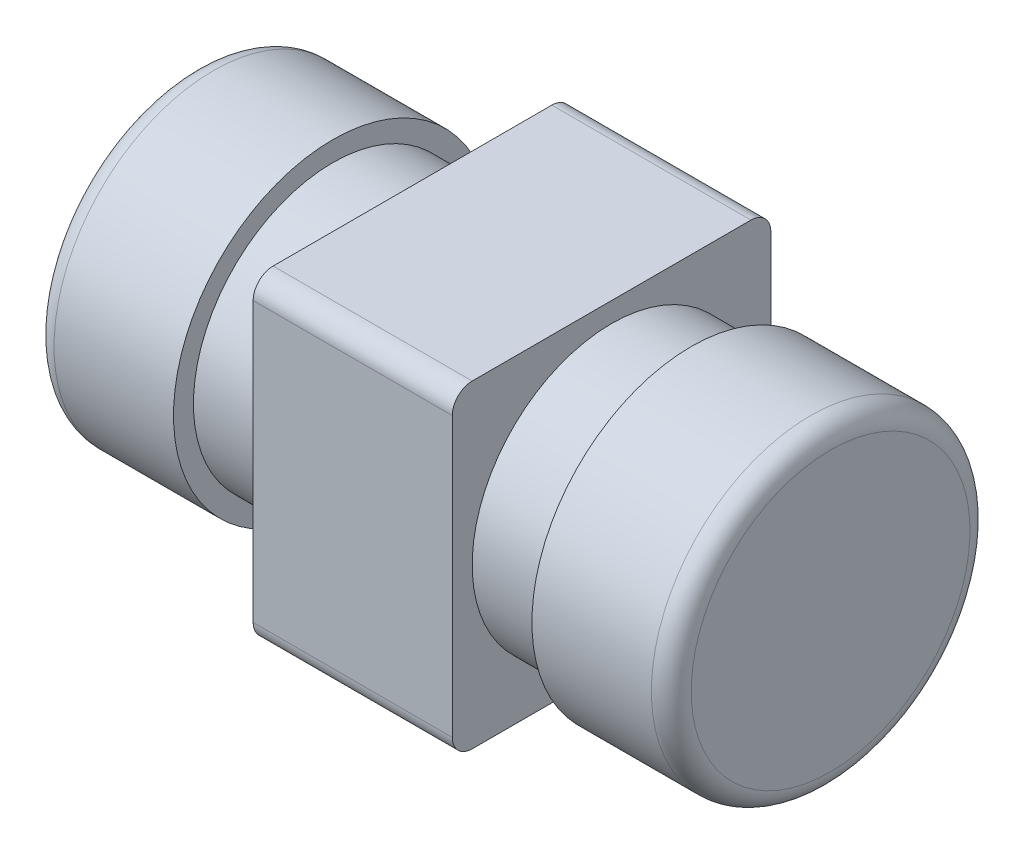
ISO-10303-21;
HEADER;
FILE_DESCRIPTION(('STEP AP214'),'2;1');
FILE_NAME('part.step','',(''),(''),'','','');
FILE_SCHEMA(('AUTOMOTIVE_DESIGN { 1 0 10303 214 1 1 1 1 }'));
ENDSEC;
DATA;
#1=APPLICATION_CONTEXT('core data for automotive mechanical design processes');
#2=APPLICATION_PROTOCOL_DEFINITION('international standard','automotive_design',2000,#1);
#3=PRODUCT_CONTEXT('',#1,'mechanical');
#4=PRODUCT('Part','Part','',(#3));
#5=PRODUCT_RELATED_PRODUCT_CATEGORY('part','',(#4));
#6=PRODUCT_DEFINITION_FORMATION('','',#4);
#7=PRODUCT_DEFINITION_CONTEXT('part definition',#1,'design');
#8=PRODUCT_DEFINITION('design','',#6,#7);
#9=PRODUCT_DEFINITION_SHAPE('','',#8);
#10=(LENGTH_UNIT() NAMED_UNIT(*) SI_UNIT(.MILLI.,.METRE.));
#11=(NAMED_UNIT(*) PLANE_ANGLE_UNIT() SI_UNIT($,.RADIAN.));
#12=(NAMED_UNIT(*) SI_UNIT($,.STERADIAN.) SOLID_ANGLE_UNIT());
#13=UNCERTAINTY_MEASURE_WITH_UNIT(LENGTH_MEASURE(1.E-05),#10,'distance_accuracy_value','');
#14=(GEOMETRIC_REPRESENTATION_CONTEXT(3) GLOBAL_UNCERTAINTY_ASSIGNED_CONTEXT((#13)) GLOBAL_UNIT_ASSIGNED_CONTEXT((#10,
#11,#12)) REPRESENTATION_CONTEXT('',''));
#15=CARTESIAN_POINT('',(0.,0.,0.));
#16=DIRECTION('',(0.,0.,1.));
#17=DIRECTION('',(1.,0.,0.));
#18=AXIS2_PLACEMENT_3D('',#15,#16,#17);
#19=CARTESIAN_POINT('',(-0.5,-0.7,1.5));
#20=DIRECTION('',(1.,0.,0.));
#21=DIRECTION('',(0.,1.,0.));
#22=AXIS2_PLACEMENT_3D('',#19,#20,#21);
#23=CYLINDRICAL_SURFACE('',#22,0.1);
#24=CARTESIAN_POINT('',(-0.5,-0.7,1.5));
#25=DIRECTION('',(-1.,0.,0.));
#26=DIRECTION('',(0.,-1.,0.));
#27=AXIS2_PLACEMENT_3D('',#24,#25,#26);
#28=CIRCLE('',#27,0.1);
#29=CARTESIAN_POINT('',(-0.5,-0.8,1.5));
#30=VERTEX_POINT('',#29);
#31=CARTESIAN_POINT('',(-0.5,-0.7,1.6));
#32=VERTEX_POINT('',#31);
#33=EDGE_CURVE('E241',#30,#32,#28,.T.);
#34=ORIENTED_EDGE('',*,*,#33,.F.);
#35=DIRECTION('',(-1.,0.,0.));
#36=VECTOR('',#35,1.);
#37=CARTESIAN_POINT('',(-0.5,-0.8,1.5));
#38=LINE('',#37,#36);
#39=CARTESIAN_POINT('',(0.5,-0.8,1.5));
#40=VERTEX_POINT('',#39);
#41=EDGE_CURVE('E199',#40,#30,#38,.T.);
#42=ORIENTED_EDGE('',*,*,#41,.F.);
#43=CARTESIAN_POINT('',(0.5,-0.7,1.5));
#44=DIRECTION('',(1.,0.,0.));
#45=DIRECTION('',(0.,1.,0.));
#46=AXIS2_PLACEMENT_3D('',#43,#44,#45);
#47=CIRCLE('',#46,0.1);
#48=CARTESIAN_POINT('',(0.5,-0.7,1.6));
#49=VERTEX_POINT('',#48);
#50=EDGE_CURVE('E202',#49,#40,#47,.T.);
#51=ORIENTED_EDGE('',*,*,#50,.F.);
#52=DIRECTION('',(1.,0.,0.));
#53=VECTOR('',#52,1.);
#54=CARTESIAN_POINT('',(-0.5,-0.7,1.6));
#55=LINE('',#54,#53);
#56=EDGE_CURVE('E203',#32,#49,#55,.T.);
#57=ORIENTED_EDGE('',*,*,#56,.F.);
#58=EDGE_LOOP('',(#34,#42,#51,#57));
#59=FACE_BOUND('',#58,.T.);
#60=ADVANCED_FACE('F17',(#59),#23,.T.);
#61=CARTESIAN_POINT('',(-0.5,-0.7,0.1));
#62=DIRECTION('',(1.,0.,0.));
#63=DIRECTION('',(0.,1.,0.));
#64=AXIS2_PLACEMENT_3D('',#61,#62,#63);
#65=CYLINDRICAL_SURFACE('',#64,0.1);
#66=CARTESIAN_POINT('',(-0.5,-0.7,0.1));
#67=DIRECTION('',(-1.,0.,0.));
#68=DIRECTION('',(0.,-1.,0.));
#69=AXIS2_PLACEMENT_3D('',#66,#67,#68);
#70=CIRCLE('',#69,0.1);
#71=CARTESIAN_POINT('',(-0.5,-0.7,0.));
#72=VERTEX_POINT('',#71);
#73=CARTESIAN_POINT('',(-0.5,-0.8,0.1));
#74=VERTEX_POINT('',#73);
#75=EDGE_CURVE('E193',#72,#74,#70,.T.);
#76=ORIENTED_EDGE('',*,*,#75,.F.);
#77=DIRECTION('',(-1.,0.,0.));
#78=VECTOR('',#77,1.);
#79=CARTESIAN_POINT('',(-0.5,-0.7,0.));
#80=LINE('',#79,#78);
#81=CARTESIAN_POINT('',(0.5,-0.7,0.));
#82=VERTEX_POINT('',#81);
#83=EDGE_CURVE('E250',#82,#72,#80,.T.);
#84=ORIENTED_EDGE('',*,*,#83,.F.);
#85=CARTESIAN_POINT('',(0.5,-0.7,0.1));
#86=DIRECTION('',(1.,0.,0.));
#87=DIRECTION('',(0.,1.,0.));
#88=AXIS2_PLACEMENT_3D('',#85,#86,#87);
#89=CIRCLE('',#88,0.1);
#90=CARTESIAN_POINT('',(0.5,-0.8,0.1));
#91=VERTEX_POINT('',#90);
#92=EDGE_CURVE('E28',#91,#82,#89,.T.);
#93=ORIENTED_EDGE('',*,*,#92,.F.);
#94=DIRECTION('',(1.,0.,0.));
#95=VECTOR('',#94,1.);
#96=CARTESIAN_POINT('',(-0.5,-0.8,0.1));
#97=LINE('',#96,#95);
#98=EDGE_CURVE('E253',#74,#91,#97,.T.);
#99=ORIENTED_EDGE('',*,*,#98,.F.);
#100=EDGE_LOOP('',(#76,#84,#93,#99));
#101=FACE_BOUND('',#100,.T.);
#102=ADVANCED_FACE('F304',(#101),#65,.T.);
#103=CARTESIAN_POINT('',(-0.5,0.7,0.1));
#104=DIRECTION('',(1.,0.,0.));
#105=DIRECTION('',(0.,1.,0.));
#106=AXIS2_PLACEMENT_3D('',#103,#104,#105);
#107=CYLINDRICAL_SURFACE('',#106,0.1);
#108=CARTESIAN_POINT('',(-0.5,0.7,0.1));
#109=DIRECTION('',(-1.,0.,0.));
#110=DIRECTION('',(0.,-1.,0.));
#111=AXIS2_PLACEMENT_3D('',#108,#109,#110);
#112=CIRCLE('',#111,0.1);
#113=CARTESIAN_POINT('',(-0.5,0.8,0.1));
#114=VERTEX_POINT('',#113);
#115=CARTESIAN_POINT('',(-0.5,0.7,0.));
#116=VERTEX_POINT('',#115);
#117=EDGE_CURVE('E147',#114,#116,#112,.T.);
#118=ORIENTED_EDGE('',*,*,#117,.F.);
#119=DIRECTION('',(-1.,0.,0.));
#120=VECTOR('',#119,1.);
#121=CARTESIAN_POINT('',(-0.5,0.8,0.1));
#122=LINE('',#121,#120);
#123=CARTESIAN_POINT('',(0.5,0.8,0.1));
#124=VERTEX_POINT('',#123);
#125=EDGE_CURVE('E134',#124,#114,#122,.T.);
#126=ORIENTED_EDGE('',*,*,#125,.F.);
#127=CARTESIAN_POINT('',(0.5,0.7,0.1));
#128=DIRECTION('',(1.,0.,0.));
#129=DIRECTION('',(0.,1.,0.));
#130=AXIS2_PLACEMENT_3D('',#127,#128,#129);
#131=CIRCLE('',#130,0.1);
#132=CARTESIAN_POINT('',(0.5,0.7,0.));
#133=VERTEX_POINT('',#132);
#134=EDGE_CURVE('E11',#133,#124,#131,.T.);
#135=ORIENTED_EDGE('',*,*,#134,.F.);
#136=DIRECTION('',(1.,0.,0.));
#137=VECTOR('',#136,1.);
#138=CARTESIAN_POINT('',(-0.5,0.7,0.));
#139=LINE('',#138,#137);
#140=EDGE_CURVE('E144',#116,#133,#139,.T.);
#141=ORIENTED_EDGE('',*,*,#140,.F.);
#142=EDGE_LOOP('',(#118,#126,#135,#141));
#143=FACE_BOUND('',#142,.T.);
#144=ADVANCED_FACE('F148',(#143),#107,.T.);
#145=CARTESIAN_POINT('',(-0.5,0.7,1.5));
#146=DIRECTION('',(1.,0.,0.));
#147=DIRECTION('',(0.,1.,0.));
#148=AXIS2_PLACEMENT_3D('',#145,#146,#147);
#149=CYLINDRICAL_SURFACE('',#148,0.1);
#150=CARTESIAN_POINT('',(-0.5,0.7,1.5));
#151=DIRECTION('',(-1.,0.,0.));
#152=DIRECTION('',(0.,-1.,0.));
#153=AXIS2_PLACEMENT_3D('',#150,#151,#152);
#154=CIRCLE('',#153,0.1);
#155=CARTESIAN_POINT('',(-0.5,0.7,1.6));
#156=VERTEX_POINT('',#155);
#157=CARTESIAN_POINT('',(-0.5,0.8,1.5));
#158=VERTEX_POINT('',#157);
#159=EDGE_CURVE('E159',#156,#158,#154,.T.);
#160=ORIENTED_EDGE('',*,*,#159,.F.);
#161=DIRECTION('',(-1.,0.,0.));
#162=VECTOR('',#161,1.);
#163=CARTESIAN_POINT('',(-0.5,0.7,1.6));
#164=LINE('',#163,#162);
#165=CARTESIAN_POINT('',(0.5,0.7,1.6));
#166=VERTEX_POINT('',#165);
#167=EDGE_CURVE('E198',#166,#156,#164,.T.);
#168=ORIENTED_EDGE('',*,*,#167,.F.);
#169=CARTESIAN_POINT('',(0.5,0.7,1.5));
#170=DIRECTION('',(1.,0.,0.));
#171=DIRECTION('',(0.,1.,0.));
#172=AXIS2_PLACEMENT_3D('',#169,#170,#171);
#173=CIRCLE('',#172,0.1);
#174=CARTESIAN_POINT('',(0.5,0.8,1.5));
#175=VERTEX_POINT('',#174);
#176=EDGE_CURVE('E42',#175,#166,#173,.T.);
#177=ORIENTED_EDGE('',*,*,#176,.F.);
#178=DIRECTION('',(1.,0.,0.));
#179=VECTOR('',#178,1.);
#180=CARTESIAN_POINT('',(-0.5,0.8,1.5));
#181=LINE('',#180,#179);
#182=EDGE_CURVE('E245',#158,#175,#181,.T.);
#183=ORIENTED_EDGE('',*,*,#182,.F.);
#184=EDGE_LOOP('',(#160,#168,#177,#183));
#185=FACE_BOUND('',#184,.T.);
#186=ADVANCED_FACE('F349',(#185),#149,.T.);
#187=CARTESIAN_POINT('',(0.5,0.,1.6));
#188=DIRECTION('',(1.,0.,0.));
#189=DIRECTION('',(0.,-1.,0.));
#190=AXIS2_PLACEMENT_3D('',#187,#188,#189);
#191=PLANE('',#190);
#192=CARTESIAN_POINT('',(0.5,0.,0.8));
#193=DIRECTION('',(-1.,0.,0.));
#194=DIRECTION('',(0.,-1.,0.));
#195=AXIS2_PLACEMENT_3D('',#192,#193,#194);
#196=CIRCLE('',#195,0.7);
#197=CARTESIAN_POINT('',(0.5,0.7,0.8));
#198=VERTEX_POINT('',#197);
#199=EDGE_CURVE('E272',#198,#198,#196,.T.);
#200=ORIENTED_EDGE('',*,*,#199,.T.);
#201=EDGE_LOOP('',(#200));
#202=FACE_BOUND('',#201,.T.);
#203=DIRECTION('',(0.,0.,-1.));
#204=VECTOR('',#203,1.);
#205=CARTESIAN_POINT('',(0.5,0.8,0.));
#206=LINE('',#205,#204);
#207=EDGE_CURVE('E141',#175,#124,#206,.T.);
#208=ORIENTED_EDGE('',*,*,#207,.F.);
#209=ORIENTED_EDGE('',*,*,#176,.T.);
#210=DIRECTION('',(0.,1.,0.));
#211=VECTOR('',#210,1.);
#212=CARTESIAN_POINT('',(0.5,-0.8,1.6));
#213=LINE('',#212,#211);
#214=EDGE_CURVE('E194',#49,#166,#213,.T.);
#215=ORIENTED_EDGE('',*,*,#214,.F.);
#216=ORIENTED_EDGE('',*,*,#50,.T.);
#217=DIRECTION('',(0.,0.,1.));
#218=VECTOR('',#217,1.);
#219=CARTESIAN_POINT('',(0.5,-0.8,0.));
#220=LINE('',#219,#218);
#221=EDGE_CURVE('E225',#91,#40,#220,.T.);
#222=ORIENTED_EDGE('',*,*,#221,.F.);
#223=ORIENTED_EDGE('',*,*,#92,.T.);
#224=DIRECTION('',(0.,-1.,0.));
#225=VECTOR('',#224,1.);
#226=CARTESIAN_POINT('',(0.5,-0.8,0.));
#227=LINE('',#226,#225);
#228=EDGE_CURVE('E21',#133,#82,#227,.T.);
#229=ORIENTED_EDGE('',*,*,#228,.F.);
#230=ORIENTED_EDGE('',*,*,#134,.T.);
#231=EDGE_LOOP('',(#208,#209,#215,#216,#222,#223,#229,#230));
#232=FACE_BOUND('',#231,.T.);
#233=ADVANCED_FACE('F345',(#202,#232),#191,.T.);
#234=CARTESIAN_POINT('',(0.9,0.,1.6));
#235=DIRECTION('',(-1.,0.,0.));
#236=DIRECTION('',(0.,0.,1.));
#237=AXIS2_PLACEMENT_3D('',#234,#235,#236);
#238=PLANE('',#237);
#239=CARTESIAN_POINT('',(0.9,0.,0.8));
#240=DIRECTION('',(-1.,0.,0.));
#241=DIRECTION('',(0.,-1.,0.));
#242=AXIS2_PLACEMENT_3D('',#239,#240,#241);
#243=CIRCLE('',#242,0.7);
#244=CARTESIAN_POINT('',(0.9,0.7,0.8));
#245=VERTEX_POINT('',#244);
#246=EDGE_CURVE('E175',#245,#245,#243,.T.);
#247=ORIENTED_EDGE('',*,*,#246,.F.);
#248=EDGE_LOOP('',(#247));
#249=FACE_BOUND('',#248,.T.);
#250=CARTESIAN_POINT('',(0.9,0.,0.8));
#251=DIRECTION('',(-1.,0.,0.));
#252=DIRECTION('',(0.,-1.,0.));
#253=AXIS2_PLACEMENT_3D('',#250,#251,#252);
#254=CIRCLE('',#253,0.8);
#255=CARTESIAN_POINT('',(0.9,-0.8,0.8));
#256=VERTEX_POINT('',#255);
#257=EDGE_CURVE('E171',#256,#256,#254,.T.);
#258=ORIENTED_EDGE('',*,*,#257,.T.);
#259=EDGE_LOOP('',(#258));
#260=FACE_BOUND('',#259,.T.);
#261=ADVANCED_FACE('F342',(#249,#260),#238,.T.);
#262=CARTESIAN_POINT('',(1.6,0.,0.8));
#263=DIRECTION('',(-1.,0.,0.));
#264=DIRECTION('',(0.,0.,1.));
#265=AXIS2_PLACEMENT_3D('',#262,#263,#264);
#266=PLANE('',#265);
#267=CARTESIAN_POINT('',(1.6,0.,0.8));
#268=DIRECTION('',(1.,0.,0.));
#269=DIRECTION('',(0.,-1.,0.));
#270=AXIS2_PLACEMENT_3D('',#267,#268,#269);
#271=CIRCLE('',#270,0.7);
#272=CARTESIAN_POINT('',(1.6,0.7,0.8));
#273=VERTEX_POINT('',#272);
#274=EDGE_CURVE('E213',#273,#273,#271,.T.);
#275=ORIENTED_EDGE('',*,*,#274,.T.);
#276=EDGE_LOOP('',(#275));
#277=FACE_BOUND('',#276,.T.);
#278=ADVANCED_FACE('F319',(#277),#266,.F.);
#279=CARTESIAN_POINT('',(-0.5,-0.8,1.6));
#280=DIRECTION('',(0.,0.,-1.));
#281=DIRECTION('',(0.,-1.,0.));
#282=AXIS2_PLACEMENT_3D('',#279,#280,#281);
#283=PLANE('',#282);
#284=ORIENTED_EDGE('',*,*,#214,.T.);
#285=ORIENTED_EDGE('',*,*,#167,.T.);
#286=DIRECTION('',(0.,1.,0.));
#287=VECTOR('',#286,1.);
#288=CARTESIAN_POINT('',(-0.5,-0.8,1.6));
#289=LINE('',#288,#287);
#290=EDGE_CURVE('E166',#32,#156,#289,.T.);
#291=ORIENTED_EDGE('',*,*,#290,.F.);
#292=ORIENTED_EDGE('',*,*,#56,.T.);
#293=EDGE_LOOP('',(#284,#285,#291,#292));
#294=FACE_BOUND('',#293,.T.);
#295=ADVANCED_FACE('F316',(#294),#283,.F.);
#296=CARTESIAN_POINT('',(-0.5,-0.8,0.));
#297=DIRECTION('',(0.,1.,0.));
#298=DIRECTION('',(1.,0.,0.));
#299=AXIS2_PLACEMENT_3D('',#296,#297,#298);
#300=PLANE('',#299);
#301=DIRECTION('',(0.,0.,1.));
#302=VECTOR('',#301,1.);
#303=CARTESIAN_POINT('',(-0.5,-0.8,0.));
#304=LINE('',#303,#302);
#305=EDGE_CURVE('E246',#74,#30,#304,.T.);
#306=ORIENTED_EDGE('',*,*,#305,.F.);
#307=ORIENTED_EDGE('',*,*,#98,.T.);
#308=ORIENTED_EDGE('',*,*,#221,.T.);
#309=ORIENTED_EDGE('',*,*,#41,.T.);
#310=EDGE_LOOP('',(#306,#307,#308,#309));
#311=FACE_BOUND('',#310,.T.);
#312=ADVANCED_FACE('F318',(#311),#300,.F.);
#313=CARTESIAN_POINT('',(-0.5,-0.8,0.));
#314=DIRECTION('',(0.,0.,1.));
#315=DIRECTION('',(0.,-1.,0.));
#316=AXIS2_PLACEMENT_3D('',#313,#314,#315);
#317=PLANE('',#316);
#318=DIRECTION('',(0.,-1.,0.));
#319=VECTOR('',#318,1.);
#320=CARTESIAN_POINT('',(-0.5,-0.8,0.));
#321=LINE('',#320,#319);
#322=EDGE_CURVE('E154',#116,#72,#321,.T.);
#323=ORIENTED_EDGE('',*,*,#322,.F.);
#324=ORIENTED_EDGE('',*,*,#140,.T.);
#325=ORIENTED_EDGE('',*,*,#228,.T.);
#326=ORIENTED_EDGE('',*,*,#83,.T.);
#327=EDGE_LOOP('',(#323,#324,#325,#326));
#328=FACE_BOUND('',#327,.T.);
#329=ADVANCED_FACE('F299',(#328),#317,.F.);
#330=CARTESIAN_POINT('',(-0.5,0.8,0.));
#331=DIRECTION('',(0.,-1.,0.));
#332=DIRECTION('',(-1.,0.,0.));
#333=AXIS2_PLACEMENT_3D('',#330,#331,#332);
#334=PLANE('',#333);
#335=DIRECTION('',(0.,0.,-1.));
#336=VECTOR('',#335,1.);
#337=CARTESIAN_POINT('',(-0.5,0.8,0.));
#338=LINE('',#337,#336);
#339=EDGE_CURVE('E139',#158,#114,#338,.T.);
#340=ORIENTED_EDGE('',*,*,#339,.F.);
#341=ORIENTED_EDGE('',*,*,#182,.T.);
#342=ORIENTED_EDGE('',*,*,#207,.T.);
#343=ORIENTED_EDGE('',*,*,#125,.T.);
#344=EDGE_LOOP('',(#340,#341,#342,#343));
#345=FACE_BOUND('',#344,.T.);
#346=ADVANCED_FACE('F136',(#345),#334,.F.);
#347=CARTESIAN_POINT('',(-0.5,0.,1.6));
#348=DIRECTION('',(-1.,0.,0.));
#349=DIRECTION('',(0.,0.,1.));
#350=AXIS2_PLACEMENT_3D('',#347,#348,#349);
#351=PLANE('',#350);
#352=CARTESIAN_POINT('',(-0.5,0.,0.8));
#353=DIRECTION('',(-1.,0.,0.));
#354=DIRECTION('',(0.,-1.,0.));
#355=AXIS2_PLACEMENT_3D('',#352,#353,#354);
#356=CIRCLE('',#355,0.7);
#357=CARTESIAN_POINT('',(-0.5,0.7,0.8));
#358=VERTEX_POINT('',#357);
#359=EDGE_CURVE('E184',#358,#358,#356,.T.);
#360=ORIENTED_EDGE('',*,*,#359,.F.);
#361=EDGE_LOOP('',(#360));
#362=FACE_BOUND('',#361,.T.);
#363=ORIENTED_EDGE('',*,*,#290,.T.);
#364=ORIENTED_EDGE('',*,*,#159,.T.);
#365=ORIENTED_EDGE('',*,*,#339,.T.);
#366=ORIENTED_EDGE('',*,*,#117,.T.);
#367=ORIENTED_EDGE('',*,*,#322,.T.);
#368=ORIENTED_EDGE('',*,*,#75,.T.);
#369=ORIENTED_EDGE('',*,*,#305,.T.);
#370=ORIENTED_EDGE('',*,*,#33,.T.);
#371=EDGE_LOOP('',(#363,#364,#365,#366,#367,#368,#369,#370));
#372=FACE_BOUND('',#371,.T.);
#373=ADVANCED_FACE('F157',(#362,#372),#351,.T.);
#374=CARTESIAN_POINT('',(-0.9,0.,1.6));
#375=DIRECTION('',(1.,0.,0.));
#376=DIRECTION('',(0.,-1.,0.));
#377=AXIS2_PLACEMENT_3D('',#374,#375,#376);
#378=PLANE('',#377);
#379=CARTESIAN_POINT('',(-0.9,0.,0.8));
#380=DIRECTION('',(-1.,0.,0.));
#381=DIRECTION('',(0.,-1.,0.));
#382=AXIS2_PLACEMENT_3D('',#379,#380,#381);
#383=CIRCLE('',#382,0.7);
#384=CARTESIAN_POINT('',(-0.9,0.7,0.8));
#385=VERTEX_POINT('',#384);
#386=EDGE_CURVE('E219',#385,#385,#383,.T.);
#387=ORIENTED_EDGE('',*,*,#386,.T.);
#388=EDGE_LOOP('',(#387));
#389=FACE_BOUND('',#388,.T.);
#390=CARTESIAN_POINT('',(-0.9,0.,0.8));
#391=DIRECTION('',(-1.,0.,0.));
#392=DIRECTION('',(0.,-1.,0.));
#393=AXIS2_PLACEMENT_3D('',#390,#391,#392);
#394=CIRCLE('',#393,0.8);
#395=CARTESIAN_POINT('',(-0.9,-0.8,0.8));
#396=VERTEX_POINT('',#395);
#397=EDGE_CURVE('E189',#396,#396,#394,.T.);
#398=ORIENTED_EDGE('',*,*,#397,.F.);
#399=EDGE_LOOP('',(#398));
#400=FACE_BOUND('',#399,.T.);
#401=ADVANCED_FACE('F289',(#389,#400),#378,.T.);
#402=CARTESIAN_POINT('',(-1.6,0.,0.8));
#403=DIRECTION('',(-1.,0.,0.));
#404=DIRECTION('',(0.,0.,1.));
#405=AXIS2_PLACEMENT_3D('',#402,#403,#404);
#406=PLANE('',#405);
#407=CARTESIAN_POINT('',(-1.6,0.,0.8));
#408=DIRECTION('',(-1.,0.,0.));
#409=DIRECTION('',(0.,-1.,0.));
#410=AXIS2_PLACEMENT_3D('',#407,#408,#409);
#411=CIRCLE('',#410,0.7);
#412=CARTESIAN_POINT('',(-1.6,0.7,0.8));
#413=VERTEX_POINT('',#412);
#414=EDGE_CURVE('E179',#413,#413,#411,.T.);
#415=ORIENTED_EDGE('',*,*,#414,.T.);
#416=EDGE_LOOP('',(#415));
#417=FACE_BOUND('',#416,.T.);
#418=ADVANCED_FACE('F296',(#417),#406,.T.);
#419=CARTESIAN_POINT('',(-1.6,0.,0.8));
#420=DIRECTION('',(1.,0.,0.));
#421=DIRECTION('',(0.,1.,0.));
#422=AXIS2_PLACEMENT_3D('',#419,#420,#421);
#423=CYLINDRICAL_SURFACE('',#422,0.8);
#424=ORIENTED_EDGE('',*,*,#397,.T.);
#425=DIRECTION('',(-1.,0.,0.));
#426=VECTOR('',#425,1.);
#427=CARTESIAN_POINT('',(-1.6,-0.8,0.8));
#428=LINE('',#427,#426);
#429=CARTESIAN_POINT('',(-1.5,-0.8,0.8));
#430=VERTEX_POINT('',#429);
#431=EDGE_CURVE('E232',#396,#430,#428,.T.);
#432=ORIENTED_EDGE('',*,*,#431,.T.);
#433=CARTESIAN_POINT('',(-1.5,0.,0.8));
#434=DIRECTION('',(1.,0.,0.));
#435=DIRECTION('',(0.,-1.,0.));
#436=AXIS2_PLACEMENT_3D('',#433,#434,#435);
#437=CIRCLE('',#436,0.8);
#438=CARTESIAN_POINT('',(-1.5,0.8,0.8));
#439=VERTEX_POINT('',#438);
#440=EDGE_CURVE('E190',#430,#439,#437,.T.);
#441=ORIENTED_EDGE('',*,*,#440,.T.);
#442=CARTESIAN_POINT('',(-1.5,0.,0.8));
#443=DIRECTION('',(1.,0.,0.));
#444=DIRECTION('',(0.,-1.,0.));
#445=AXIS2_PLACEMENT_3D('',#442,#443,#444);
#446=CIRCLE('',#445,0.8);
#447=EDGE_CURVE('E185',#439,#430,#446,.T.);
#448=ORIENTED_EDGE('',*,*,#447,.T.);
#449=ORIENTED_EDGE('',*,*,#431,.F.);
#450=EDGE_LOOP('',(#424,#432,#441,#448,#449));
#451=FACE_BOUND('',#450,.T.);
#452=ADVANCED_FACE('F323',(#451),#423,.T.);
#453=CARTESIAN_POINT('',(-1.5,0.,0.8));
#454=DIRECTION('',(-1.,0.,0.));
#455=DIRECTION('',(0.,-1.,0.));
#456=AXIS2_PLACEMENT_3D('',#453,#454,#455);
#457=TOROIDAL_SURFACE('',#456,0.7,0.1);
#458=ORIENTED_EDGE('',*,*,#414,.F.);
#459=CARTESIAN_POINT('',(-1.5,0.7,0.8));
#460=DIRECTION('',(0.,0.,-1.));
#461=DIRECTION('',(0.,1.,0.));
#462=AXIS2_PLACEMENT_3D('',#459,#460,#461);
#463=CIRCLE('',#462,0.1);
#464=EDGE_CURVE('E183',#413,#439,#463,.T.);
#465=ORIENTED_EDGE('',*,*,#464,.T.);
#466=ORIENTED_EDGE('',*,*,#440,.F.);
#467=ORIENTED_EDGE('',*,*,#447,.F.);
#468=ORIENTED_EDGE('',*,*,#464,.F.);
#469=EDGE_LOOP('',(#458,#465,#466,#467,#468));
#470=FACE_BOUND('',#469,.T.);
#471=ADVANCED_FACE('F321',(#470),#457,.T.);
#472=CARTESIAN_POINT('',(-1.6,0.,0.8));
#473=DIRECTION('',(-1.,0.,0.));
#474=DIRECTION('',(0.,-1.,0.));
#475=AXIS2_PLACEMENT_3D('',#472,#473,#474);
#476=CYLINDRICAL_SURFACE('',#475,0.7);
#477=ORIENTED_EDGE('',*,*,#386,.F.);
#478=DIRECTION('',(1.,0.,0.));
#479=VECTOR('',#478,1.);
#480=CARTESIAN_POINT('',(-1.6,0.7,0.8));
#481=LINE('',#480,#479);
#482=EDGE_CURVE('E215',#385,#358,#481,.T.);
#483=ORIENTED_EDGE('',*,*,#482,.T.);
#484=ORIENTED_EDGE('',*,*,#359,.T.);
#485=ORIENTED_EDGE('',*,*,#482,.F.);
#486=EDGE_LOOP('',(#477,#483,#484,#485));
#487=FACE_BOUND('',#486,.T.);
#488=ADVANCED_FACE('F286',(#487),#476,.T.);
#489=CARTESIAN_POINT('',(1.5,0.,0.8));
#490=DIRECTION('',(-1.,0.,0.));
#491=DIRECTION('',(0.,-1.,0.));
#492=AXIS2_PLACEMENT_3D('',#489,#490,#491);
#493=TOROIDAL_SURFACE('',#492,0.7,0.1);
#494=CARTESIAN_POINT('',(1.5,0.,0.8));
#495=DIRECTION('',(-1.,0.,0.));
#496=DIRECTION('',(0.,-1.,0.));
#497=AXIS2_PLACEMENT_3D('',#494,#495,#496);
#498=CIRCLE('',#497,0.8);
#499=CARTESIAN_POINT('',(1.5,0.8,0.8));
#500=VERTEX_POINT('',#499);
#501=CARTESIAN_POINT('',(1.5,-0.8,0.8));
#502=VERTEX_POINT('',#501);
#503=EDGE_CURVE('E170',#500,#502,#498,.T.);
#504=ORIENTED_EDGE('',*,*,#503,.F.);
#505=CARTESIAN_POINT('',(1.5,0.7,0.8));
#506=DIRECTION('',(0.,0.,-1.));
#507=DIRECTION('',(0.,1.,0.));
#508=AXIS2_PLACEMENT_3D('',#505,#506,#507);
#509=CIRCLE('',#508,0.1);
#510=EDGE_CURVE('E210',#500,#273,#509,.T.);
#511=ORIENTED_EDGE('',*,*,#510,.T.);
#512=ORIENTED_EDGE('',*,*,#274,.F.);
#513=ORIENTED_EDGE('',*,*,#510,.F.);
#514=CARTESIAN_POINT('',(1.5,0.,0.8));
#515=DIRECTION('',(-1.,0.,0.));
#516=DIRECTION('',(0.,-1.,0.));
#517=AXIS2_PLACEMENT_3D('',#514,#515,#516);
#518=CIRCLE('',#517,0.8);
#519=EDGE_CURVE('E173',#502,#500,#518,.T.);
#520=ORIENTED_EDGE('',*,*,#519,.F.);
#521=EDGE_LOOP('',(#504,#511,#512,#513,#520));
#522=FACE_BOUND('',#521,.T.);
#523=ADVANCED_FACE('F329',(#522),#493,.T.);
#524=CARTESIAN_POINT('',(-1.6,0.,0.8));
#525=DIRECTION('',(1.,0.,0.));
#526=DIRECTION('',(0.,1.,0.));
#527=AXIS2_PLACEMENT_3D('',#524,#525,#526);
#528=CYLINDRICAL_SURFACE('',#527,0.8);
#529=ORIENTED_EDGE('',*,*,#503,.T.);
#530=DIRECTION('',(-1.,0.,0.));
#531=VECTOR('',#530,1.);
#532=CARTESIAN_POINT('',(-1.6,-0.8,0.8));
#533=LINE('',#532,#531);
#534=EDGE_CURVE('E174',#502,#256,#533,.T.);
#535=ORIENTED_EDGE('',*,*,#534,.T.);
#536=ORIENTED_EDGE('',*,*,#257,.F.);
#537=ORIENTED_EDGE('',*,*,#534,.F.);
#538=ORIENTED_EDGE('',*,*,#519,.T.);
#539=EDGE_LOOP('',(#529,#535,#536,#537,#538));
#540=FACE_BOUND('',#539,.T.);
#541=ADVANCED_FACE('F352',(#540),#528,.T.);
#542=CARTESIAN_POINT('',(-1.6,0.,0.8));
#543=DIRECTION('',(-1.,0.,0.));
#544=DIRECTION('',(0.,-1.,0.));
#545=AXIS2_PLACEMENT_3D('',#542,#543,#544);
#546=CYLINDRICAL_SURFACE('',#545,0.7);
#547=ORIENTED_EDGE('',*,*,#199,.F.);
#548=DIRECTION('',(1.,0.,0.));
#549=VECTOR('',#548,1.);
#550=CARTESIAN_POINT('',(-1.6,0.7,0.8));
#551=LINE('',#550,#549);
#552=EDGE_CURVE('E178',#198,#245,#551,.T.);
#553=ORIENTED_EDGE('',*,*,#552,.T.);
#554=ORIENTED_EDGE('',*,*,#246,.T.);
#555=ORIENTED_EDGE('',*,*,#552,.F.);
#556=EDGE_LOOP('',(#547,#553,#554,#555));
#557=FACE_BOUND('',#556,.T.);
#558=ADVANCED_FACE('F19',(#557),#546,.T.);
#559=CLOSED_SHELL('',(#60,#102,#144,#186,#233,#261,#278,#295,#312,#329,#346,#373,#401,#418,#452,
#471,#488,#523,#541,#558));
#560=MANIFOLD_SOLID_BREP('B1',#559);
#561=ADVANCED_BREP_SHAPE_REPRESENTATION('',(#18,#560),#14);
#562=SHAPE_DEFINITION_REPRESENTATION(#9,#561);
ENDSEC;
END-ISO-10303-21;
